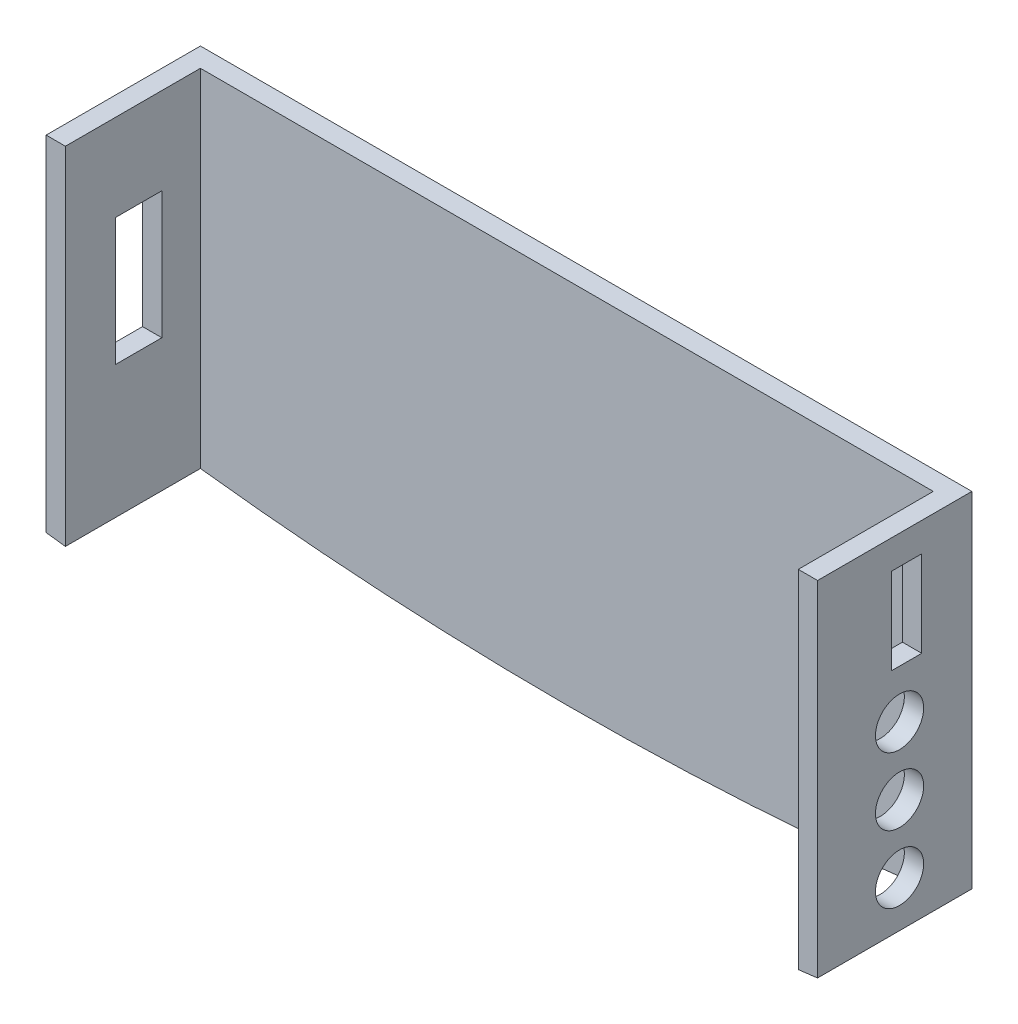
ISO-10303-21;
HEADER;
FILE_DESCRIPTION(('STEP AP214'),'2;1');
FILE_NAME('part.step','',(''),(''),'','','');
FILE_SCHEMA(('AUTOMOTIVE_DESIGN { 1 0 10303 214 1 1 1 1 }'));
ENDSEC;
DATA;
#1=APPLICATION_CONTEXT('core data for automotive mechanical design processes');
#2=APPLICATION_PROTOCOL_DEFINITION('international standard','automotive_design',2000,#1);
#3=PRODUCT_CONTEXT('',#1,'mechanical');
#4=PRODUCT('Part','Part','',(#3));
#5=PRODUCT_RELATED_PRODUCT_CATEGORY('part','',(#4));
#6=PRODUCT_DEFINITION_FORMATION('','',#4);
#7=PRODUCT_DEFINITION_CONTEXT('part definition',#1,'design');
#8=PRODUCT_DEFINITION('design','',#6,#7);
#9=PRODUCT_DEFINITION_SHAPE('','',#8);
#10=(LENGTH_UNIT() NAMED_UNIT(*) SI_UNIT(.MILLI.,.METRE.));
#11=(NAMED_UNIT(*) PLANE_ANGLE_UNIT() SI_UNIT($,.RADIAN.));
#12=(NAMED_UNIT(*) SI_UNIT($,.STERADIAN.) SOLID_ANGLE_UNIT());
#13=UNCERTAINTY_MEASURE_WITH_UNIT(LENGTH_MEASURE(1.E-05),#10,'distance_accuracy_value','');
#14=(GEOMETRIC_REPRESENTATION_CONTEXT(3) GLOBAL_UNCERTAINTY_ASSIGNED_CONTEXT((#13)) GLOBAL_UNIT_ASSIGNED_CONTEXT((#10,
#11,#12)) REPRESENTATION_CONTEXT('',''));
#15=CARTESIAN_POINT('',(0.,0.,0.));
#16=DIRECTION('',(0.,0.,1.));
#17=DIRECTION('',(1.,0.,0.));
#18=AXIS2_PLACEMENT_3D('',#15,#16,#17);
#19=CARTESIAN_POINT('',(0.,0.,16.));
#20=DIRECTION('',(0.,0.,1.));
#21=DIRECTION('',(1.,0.,0.));
#22=AXIS2_PLACEMENT_3D('',#19,#20,#21);
#23=PLANE('',#22);
#24=CARTESIAN_POINT('',(-50.4205664671254,289.886586920608,16.));
#25=DIRECTION('',(0.,0.,1.));
#26=DIRECTION('',(1.,0.,0.));
#27=AXIS2_PLACEMENT_3D('',#24,#25,#26);
#28=CIRCLE('',#27,321.75);
#29=CARTESIAN_POINT('',(-90.4205664671254,-29.3673284821631,16.));
#30=VERTEX_POINT('',#29);
#31=CARTESIAN_POINT('',(-88.4205664671254,-29.6115547015299,16.));
#32=VERTEX_POINT('',#31);
#33=EDGE_CURVE('E313',#30,#32,#28,.T.);
#34=ORIENTED_EDGE('',*,*,#33,.T.);
#35=DIRECTION('',(0.,1.,0.));
#36=VECTOR('',#35,1.);
#37=CARTESIAN_POINT('',(-88.4205664671254,0.,16.));
#38=LINE('',#37,#36);
#39=CARTESIAN_POINT('',(-88.4205664671254,6.33267151783695,16.));
#40=VERTEX_POINT('',#39);
#41=EDGE_CURVE('E295',#32,#40,#38,.T.);
#42=ORIENTED_EDGE('',*,*,#41,.T.);
#43=DIRECTION('',(-1.,0.,0.));
#44=VECTOR('',#43,1.);
#45=CARTESIAN_POINT('',(0.,6.33267151783695,16.));
#46=LINE('',#45,#44);
#47=CARTESIAN_POINT('',(-90.4205664671254,6.33267151783695,16.));
#48=VERTEX_POINT('',#47);
#49=EDGE_CURVE('E320',#40,#48,#46,.T.);
#50=ORIENTED_EDGE('',*,*,#49,.T.);
#51=DIRECTION('',(0.,1.,0.));
#52=VECTOR('',#51,1.);
#53=CARTESIAN_POINT('',(-90.4205664671254,0.,16.));
#54=LINE('',#53,#52);
#55=EDGE_CURVE('E307',#30,#48,#54,.T.);
#56=ORIENTED_EDGE('',*,*,#55,.F.);
#57=EDGE_LOOP('',(#34,#42,#50,#56));
#58=FACE_BOUND('',#57,.T.);
#59=ADVANCED_FACE('F45',(#58),#23,.T.);
#60=CARTESIAN_POINT('',(-90.4205664671254,0.,16.));
#61=DIRECTION('',(-1.,0.,0.));
#62=DIRECTION('',(0.,0.,1.));
#63=AXIS2_PLACEMENT_3D('',#60,#61,#62);
#64=PLANE('',#63);
#65=DIRECTION('',(0.,-1.,0.));
#66=VECTOR('',#65,1.);
#67=CARTESIAN_POINT('',(-90.4205664671254,-2.66732848216305,6.));
#68=LINE('',#67,#66);
#69=CARTESIAN_POINT('',(-90.4205664671254,-2.66732848216305,6.));
#70=VERTEX_POINT('',#69);
#71=CARTESIAN_POINT('',(-90.4205664671254,-15.8673284821631,6.));
#72=VERTEX_POINT('',#71);
#73=EDGE_CURVE('E239',#70,#72,#68,.T.);
#74=ORIENTED_EDGE('',*,*,#73,.F.);
#75=DIRECTION('',(0.,0.,-1.));
#76=VECTOR('',#75,1.);
#77=CARTESIAN_POINT('',(-90.4205664671254,-2.66732848216305,6.));
#78=LINE('',#77,#76);
#79=CARTESIAN_POINT('',(-90.4205664671254,-2.66732848216305,10.8));
#80=VERTEX_POINT('',#79);
#81=EDGE_CURVE('E250',#80,#70,#78,.T.);
#82=ORIENTED_EDGE('',*,*,#81,.F.);
#83=DIRECTION('',(0.,1.,0.));
#84=VECTOR('',#83,1.);
#85=CARTESIAN_POINT('',(-90.4205664671254,-2.66732848216305,10.8));
#86=LINE('',#85,#84);
#87=CARTESIAN_POINT('',(-90.4205664671254,-15.8673284821631,10.8));
#88=VERTEX_POINT('',#87);
#89=EDGE_CURVE('E246',#88,#80,#86,.T.);
#90=ORIENTED_EDGE('',*,*,#89,.F.);
#91=DIRECTION('',(0.,0.,1.));
#92=VECTOR('',#91,1.);
#93=CARTESIAN_POINT('',(-90.4205664671254,-15.8673284821631,6.));
#94=LINE('',#93,#92);
#95=EDGE_CURVE('E242',#72,#88,#94,.T.);
#96=ORIENTED_EDGE('',*,*,#95,.F.);
#97=EDGE_LOOP('',(#74,#82,#90,#96));
#98=FACE_BOUND('',#97,.T.);
#99=DIRECTION('',(0.,1.,0.));
#100=VECTOR('',#99,1.);
#101=CARTESIAN_POINT('',(-90.4205664671254,0.,0.));
#102=LINE('',#101,#100);
#103=CARTESIAN_POINT('',(-90.4205664671254,-29.3673284821631,0.));
#104=VERTEX_POINT('',#103);
#105=CARTESIAN_POINT('',(-90.4205664671254,6.33267151783695,0.));
#106=VERTEX_POINT('',#105);
#107=EDGE_CURVE('E283',#104,#106,#102,.T.);
#108=ORIENTED_EDGE('',*,*,#107,.F.);
#109=DIRECTION('',(0.,0.,-1.));
#110=VECTOR('',#109,1.);
#111=CARTESIAN_POINT('',(-90.4205664671254,-29.3673284821631,16.));
#112=LINE('',#111,#110);
#113=EDGE_CURVE('E11',#30,#104,#112,.T.);
#114=ORIENTED_EDGE('',*,*,#113,.F.);
#115=ORIENTED_EDGE('',*,*,#55,.T.);
#116=DIRECTION('',(0.,0.,-1.));
#117=VECTOR('',#116,1.);
#118=CARTESIAN_POINT('',(-90.4205664671254,6.33267151783695,16.));
#119=LINE('',#118,#117);
#120=EDGE_CURVE('E325',#48,#106,#119,.T.);
#121=ORIENTED_EDGE('',*,*,#120,.T.);
#122=EDGE_LOOP('',(#108,#114,#115,#121));
#123=FACE_BOUND('',#122,.T.);
#124=ADVANCED_FACE('F47',(#98,#123),#64,.T.);
#125=CARTESIAN_POINT('',(-50.4205664671254,289.886586920608,16.));
#126=DIRECTION('',(0.,0.,-1.));
#127=DIRECTION('',(-1.,0.,0.));
#128=AXIS2_PLACEMENT_3D('',#125,#126,#127);
#129=CYLINDRICAL_SURFACE('',#128,321.75);
#130=CARTESIAN_POINT('',(-12.4205664671254,-29.6115547015299,16.));
#131=VERTEX_POINT('',#130);
#132=CARTESIAN_POINT('',(-10.4205664671254,-29.3673284821631,16.));
#133=VERTEX_POINT('',#132);
#134=EDGE_CURVE('E311',#131,#133,#28,.T.);
#135=ORIENTED_EDGE('',*,*,#134,.F.);
#136=DIRECTION('',(0.,0.,-1.));
#137=VECTOR('',#136,1.);
#138=CARTESIAN_POINT('',(-12.4205664671254,-29.6115547015299,16.));
#139=LINE('',#138,#137);
#140=CARTESIAN_POINT('',(-12.4205664671254,-29.61155470153,2.));
#141=VERTEX_POINT('',#140);
#142=EDGE_CURVE('E284',#131,#141,#139,.T.);
#143=ORIENTED_EDGE('',*,*,#142,.T.);
#144=CARTESIAN_POINT('',(-50.4205664671254,289.886586920608,2.));
#145=DIRECTION('',(0.,0.,1.));
#146=DIRECTION('',(1.,0.,0.));
#147=AXIS2_PLACEMENT_3D('',#144,#145,#146);
#148=CIRCLE('',#147,321.75);
#149=CARTESIAN_POINT('',(-88.4205664671254,-29.61155470153,2.));
#150=VERTEX_POINT('',#149);
#151=EDGE_CURVE('E275',#150,#141,#148,.T.);
#152=ORIENTED_EDGE('',*,*,#151,.F.);
#153=DIRECTION('',(0.,0.,-1.));
#154=VECTOR('',#153,1.);
#155=CARTESIAN_POINT('',(-88.4205664671254,-29.6115547015299,16.));
#156=LINE('',#155,#154);
#157=EDGE_CURVE('E280',#32,#150,#156,.T.);
#158=ORIENTED_EDGE('',*,*,#157,.F.);
#159=ORIENTED_EDGE('',*,*,#33,.F.);
#160=ORIENTED_EDGE('',*,*,#113,.T.);
#161=CARTESIAN_POINT('',(-50.4205664671254,289.886586920608,0.));
#162=DIRECTION('',(0.,0.,1.));
#163=DIRECTION('',(1.,0.,0.));
#164=AXIS2_PLACEMENT_3D('',#161,#162,#163);
#165=CIRCLE('',#164,321.75);
#166=CARTESIAN_POINT('',(-10.4205664671254,-29.3673284821631,0.));
#167=VERTEX_POINT('',#166);
#168=EDGE_CURVE('E329',#104,#167,#165,.T.);
#169=ORIENTED_EDGE('',*,*,#168,.T.);
#170=DIRECTION('',(0.,0.,-1.));
#171=VECTOR('',#170,1.);
#172=CARTESIAN_POINT('',(-10.4205664671254,-29.3673284821631,16.));
#173=LINE('',#172,#171);
#174=EDGE_CURVE('E54',#133,#167,#173,.T.);
#175=ORIENTED_EDGE('',*,*,#174,.F.);
#176=EDGE_LOOP('',(#135,#143,#152,#158,#159,#160,#169,#175));
#177=FACE_BOUND('',#176,.T.);
#178=ADVANCED_FACE('F380',(#177),#129,.T.);
#179=CARTESIAN_POINT('',(-10.4205664671254,0.,16.));
#180=DIRECTION('',(-1.,0.,0.));
#181=DIRECTION('',(0.,0.,1.));
#182=AXIS2_PLACEMENT_3D('',#179,#180,#181);
#183=PLANE('',#182);
#184=DIRECTION('',(0.,0.,-1.));
#185=VECTOR('',#184,1.);
#186=CARTESIAN_POINT('',(-10.4205664671254,-5.60732848216305,8.36));
#187=LINE('',#186,#185);
#188=CARTESIAN_POINT('',(-10.4205664671254,-5.60732848216305,8.36));
#189=VERTEX_POINT('',#188);
#190=CARTESIAN_POINT('',(-10.4205664671254,-5.60732848216305,5.2));
#191=VERTEX_POINT('',#190);
#192=EDGE_CURVE('E61',#189,#191,#187,.T.);
#193=ORIENTED_EDGE('',*,*,#192,.F.);
#194=DIRECTION('',(0.,-1.,0.));
#195=VECTOR('',#194,1.);
#196=CARTESIAN_POINT('',(-10.4205664671254,3.33267151783695,8.36));
#197=LINE('',#196,#195);
#198=CARTESIAN_POINT('',(-10.4205664671254,3.33267151783695,8.36));
#199=VERTEX_POINT('',#198);
#200=EDGE_CURVE('E193',#199,#189,#197,.T.);
#201=ORIENTED_EDGE('',*,*,#200,.F.);
#202=DIRECTION('',(0.,0.,1.));
#203=VECTOR('',#202,1.);
#204=CARTESIAN_POINT('',(-10.4205664671254,3.33267151783695,8.36));
#205=LINE('',#204,#203);
#206=CARTESIAN_POINT('',(-10.4205664671254,3.33267151783695,5.2));
#207=VERTEX_POINT('',#206);
#208=EDGE_CURVE('E183',#207,#199,#205,.T.);
#209=ORIENTED_EDGE('',*,*,#208,.F.);
#210=DIRECTION('',(0.,1.,0.));
#211=VECTOR('',#210,1.);
#212=CARTESIAN_POINT('',(-10.4205664671254,3.33267151783695,5.2));
#213=LINE('',#212,#211);
#214=EDGE_CURVE('E188',#191,#207,#213,.T.);
#215=ORIENTED_EDGE('',*,*,#214,.F.);
#216=EDGE_LOOP('',(#193,#201,#209,#215));
#217=FACE_BOUND('',#216,.T.);
#218=CARTESIAN_POINT('',(-10.4205664671254,-10.6073284821631,7.5));
#219=DIRECTION('',(1.,0.,0.));
#220=DIRECTION('',(0.,0.,-1.));
#221=AXIS2_PLACEMENT_3D('',#218,#219,#220);
#222=CIRCLE('',#221,2.5);
#223=CARTESIAN_POINT('',(-10.4205664671254,-10.6073284821631,5.));
#224=VERTEX_POINT('',#223);
#225=EDGE_CURVE('E206',#224,#224,#222,.T.);
#226=ORIENTED_EDGE('',*,*,#225,.F.);
#227=EDGE_LOOP('',(#226));
#228=FACE_BOUND('',#227,.T.);
#229=CARTESIAN_POINT('',(-10.4205664671254,-17.6073284821631,7.5));
#230=DIRECTION('',(1.,0.,0.));
#231=DIRECTION('',(0.,0.,-1.));
#232=AXIS2_PLACEMENT_3D('',#229,#230,#231);
#233=CIRCLE('',#232,2.5);
#234=CARTESIAN_POINT('',(-10.4205664671254,-17.6073284821631,5.));
#235=VERTEX_POINT('',#234);
#236=EDGE_CURVE('E214',#235,#235,#233,.T.);
#237=ORIENTED_EDGE('',*,*,#236,.F.);
#238=EDGE_LOOP('',(#237));
#239=FACE_BOUND('',#238,.T.);
#240=CARTESIAN_POINT('',(-10.4205664671254,-24.6073284821631,7.5));
#241=DIRECTION('',(1.,0.,0.));
#242=DIRECTION('',(0.,0.,-1.));
#243=AXIS2_PLACEMENT_3D('',#240,#241,#242);
#244=CIRCLE('',#243,2.5);
#245=CARTESIAN_POINT('',(-10.4205664671254,-24.6073284821631,5.));
#246=VERTEX_POINT('',#245);
#247=EDGE_CURVE('E218',#246,#246,#244,.T.);
#248=ORIENTED_EDGE('',*,*,#247,.F.);
#249=EDGE_LOOP('',(#248));
#250=FACE_BOUND('',#249,.T.);
#251=DIRECTION('',(0.,1.,0.));
#252=VECTOR('',#251,1.);
#253=CARTESIAN_POINT('',(-10.4205664671254,0.,0.));
#254=LINE('',#253,#252);
#255=CARTESIAN_POINT('',(-10.4205664671254,6.33267151783695,0.));
#256=VERTEX_POINT('',#255);
#257=EDGE_CURVE('E332',#167,#256,#254,.T.);
#258=ORIENTED_EDGE('',*,*,#257,.T.);
#259=DIRECTION('',(0.,0.,-1.));
#260=VECTOR('',#259,1.);
#261=CARTESIAN_POINT('',(-10.4205664671254,6.33267151783695,16.));
#262=LINE('',#261,#260);
#263=CARTESIAN_POINT('',(-10.4205664671254,6.33267151783695,16.));
#264=VERTEX_POINT('',#263);
#265=EDGE_CURVE('E340',#264,#256,#262,.T.);
#266=ORIENTED_EDGE('',*,*,#265,.F.);
#267=DIRECTION('',(0.,1.,0.));
#268=VECTOR('',#267,1.);
#269=CARTESIAN_POINT('',(-10.4205664671254,0.,16.));
#270=LINE('',#269,#268);
#271=EDGE_CURVE('E317',#133,#264,#270,.T.);
#272=ORIENTED_EDGE('',*,*,#271,.F.);
#273=ORIENTED_EDGE('',*,*,#174,.T.);
#274=EDGE_LOOP('',(#258,#266,#272,#273));
#275=FACE_BOUND('',#274,.T.);
#276=ADVANCED_FACE('F349',(#217,#228,#239,#250,#275),#183,.F.);
#277=CARTESIAN_POINT('',(0.,6.33267151783695,16.));
#278=DIRECTION('',(0.,-1.,0.));
#279=DIRECTION('',(0.,0.,-1.));
#280=AXIS2_PLACEMENT_3D('',#277,#278,#279);
#281=PLANE('',#280);
#282=ORIENTED_EDGE('',*,*,#49,.F.);
#283=DIRECTION('',(0.,0.,-1.));
#284=VECTOR('',#283,1.);
#285=CARTESIAN_POINT('',(-88.4205664671254,6.33267151783695,16.));
#286=LINE('',#285,#284);
#287=CARTESIAN_POINT('',(-88.4205664671254,6.33267151783695,2.));
#288=VERTEX_POINT('',#287);
#289=EDGE_CURVE('E294',#40,#288,#286,.T.);
#290=ORIENTED_EDGE('',*,*,#289,.T.);
#291=DIRECTION('',(-1.,0.,0.));
#292=VECTOR('',#291,1.);
#293=CARTESIAN_POINT('',(0.,6.33267151783695,2.));
#294=LINE('',#293,#292);
#295=CARTESIAN_POINT('',(-12.4205664671254,6.33267151783695,2.));
#296=VERTEX_POINT('',#295);
#297=EDGE_CURVE('E279',#296,#288,#294,.T.);
#298=ORIENTED_EDGE('',*,*,#297,.F.);
#299=DIRECTION('',(0.,0.,-1.));
#300=VECTOR('',#299,1.);
#301=CARTESIAN_POINT('',(-12.4205664671254,6.33267151783695,16.));
#302=LINE('',#301,#300);
#303=CARTESIAN_POINT('',(-12.4205664671254,6.33267151783695,16.));
#304=VERTEX_POINT('',#303);
#305=EDGE_CURVE('E290',#304,#296,#302,.T.);
#306=ORIENTED_EDGE('',*,*,#305,.F.);
#307=EDGE_CURVE('E321',#264,#304,#46,.T.);
#308=ORIENTED_EDGE('',*,*,#307,.F.);
#309=ORIENTED_EDGE('',*,*,#265,.T.);
#310=DIRECTION('',(-1.,0.,0.));
#311=VECTOR('',#310,1.);
#312=CARTESIAN_POINT('',(0.,6.33267151783695,0.));
#313=LINE('',#312,#311);
#314=EDGE_CURVE('E312',#256,#106,#313,.T.);
#315=ORIENTED_EDGE('',*,*,#314,.T.);
#316=ORIENTED_EDGE('',*,*,#120,.F.);
#317=EDGE_LOOP('',(#282,#290,#298,#306,#308,#309,#315,#316));
#318=FACE_BOUND('',#317,.T.);
#319=ADVANCED_FACE('F361',(#318),#281,.F.);
#320=DIRECTION('',(0.,1.,0.));
#321=VECTOR('',#320,1.);
#322=CARTESIAN_POINT('',(-12.4205664671254,0.,16.));
#323=LINE('',#322,#321);
#324=EDGE_CURVE('E291',#131,#304,#323,.T.);
#325=ORIENTED_EDGE('',*,*,#324,.F.);
#326=ORIENTED_EDGE('',*,*,#134,.T.);
#327=ORIENTED_EDGE('',*,*,#271,.T.);
#328=ORIENTED_EDGE('',*,*,#307,.T.);
#329=EDGE_LOOP('',(#325,#326,#327,#328));
#330=FACE_BOUND('',#329,.T.);
#331=ADVANCED_FACE('F367',(#330),#23,.T.);
#332=CARTESIAN_POINT('',(0.,0.,0.));
#333=DIRECTION('',(0.,0.,1.));
#334=DIRECTION('',(1.,0.,0.));
#335=AXIS2_PLACEMENT_3D('',#332,#333,#334);
#336=PLANE('',#335);
#337=ORIENTED_EDGE('',*,*,#107,.T.);
#338=ORIENTED_EDGE('',*,*,#314,.F.);
#339=ORIENTED_EDGE('',*,*,#257,.F.);
#340=ORIENTED_EDGE('',*,*,#168,.F.);
#341=EDGE_LOOP('',(#337,#338,#339,#340));
#342=FACE_BOUND('',#341,.T.);
#343=ADVANCED_FACE('F356',(#342),#336,.F.);
#344=CARTESIAN_POINT('',(-88.4205664671254,0.,16.));
#345=DIRECTION('',(-1.,0.,0.));
#346=DIRECTION('',(0.,0.,1.));
#347=AXIS2_PLACEMENT_3D('',#344,#345,#346);
#348=PLANE('',#347);
#349=DIRECTION('',(0.,0.,1.));
#350=VECTOR('',#349,1.);
#351=CARTESIAN_POINT('',(-88.4205664671254,-2.66732848216305,6.));
#352=LINE('',#351,#350);
#353=CARTESIAN_POINT('',(-88.4205664671254,-2.66732848216305,6.));
#354=VERTEX_POINT('',#353);
#355=CARTESIAN_POINT('',(-88.4205664671254,-2.66732848216305,10.8));
#356=VERTEX_POINT('',#355);
#357=EDGE_CURVE('E231',#354,#356,#352,.T.);
#358=ORIENTED_EDGE('',*,*,#357,.F.);
#359=DIRECTION('',(0.,1.,0.));
#360=VECTOR('',#359,1.);
#361=CARTESIAN_POINT('',(-88.4205664671254,-2.66732848216305,6.));
#362=LINE('',#361,#360);
#363=CARTESIAN_POINT('',(-88.4205664671254,-15.8673284821631,6.));
#364=VERTEX_POINT('',#363);
#365=EDGE_CURVE('E235',#364,#354,#362,.T.);
#366=ORIENTED_EDGE('',*,*,#365,.F.);
#367=DIRECTION('',(0.,0.,-1.));
#368=VECTOR('',#367,1.);
#369=CARTESIAN_POINT('',(-88.4205664671254,-15.8673284821631,6.));
#370=LINE('',#369,#368);
#371=CARTESIAN_POINT('',(-88.4205664671254,-15.8673284821631,10.8));
#372=VERTEX_POINT('',#371);
#373=EDGE_CURVE('E258',#372,#364,#370,.T.);
#374=ORIENTED_EDGE('',*,*,#373,.F.);
#375=DIRECTION('',(0.,-1.,0.));
#376=VECTOR('',#375,1.);
#377=CARTESIAN_POINT('',(-88.4205664671254,-2.66732848216305,10.8));
#378=LINE('',#377,#376);
#379=EDGE_CURVE('E187',#356,#372,#378,.T.);
#380=ORIENTED_EDGE('',*,*,#379,.F.);
#381=EDGE_LOOP('',(#358,#366,#374,#380));
#382=FACE_BOUND('',#381,.T.);
#383=DIRECTION('',(0.,1.,0.));
#384=VECTOR('',#383,1.);
#385=CARTESIAN_POINT('',(-88.4205664671254,0.,2.));
#386=LINE('',#385,#384);
#387=EDGE_CURVE('E271',#150,#288,#386,.T.);
#388=ORIENTED_EDGE('',*,*,#387,.T.);
#389=ORIENTED_EDGE('',*,*,#289,.F.);
#390=ORIENTED_EDGE('',*,*,#41,.F.);
#391=ORIENTED_EDGE('',*,*,#157,.T.);
#392=EDGE_LOOP('',(#388,#389,#390,#391));
#393=FACE_BOUND('',#392,.T.);
#394=ADVANCED_FACE('F373',(#382,#393),#348,.F.);
#395=CARTESIAN_POINT('',(-12.4205664671254,0.,16.));
#396=DIRECTION('',(-1.,0.,0.));
#397=DIRECTION('',(0.,0.,1.));
#398=AXIS2_PLACEMENT_3D('',#395,#396,#397);
#399=PLANE('',#398);
#400=DIRECTION('',(0.,-1.,0.));
#401=VECTOR('',#400,1.);
#402=CARTESIAN_POINT('',(-12.4205664671254,3.33267151783695,8.36));
#403=LINE('',#402,#401);
#404=CARTESIAN_POINT('',(-12.4205664671254,3.33267151783695,8.36));
#405=VERTEX_POINT('',#404);
#406=CARTESIAN_POINT('',(-12.4205664671254,-5.60732848216305,8.36));
#407=VERTEX_POINT('',#406);
#408=EDGE_CURVE('E176',#405,#407,#403,.T.);
#409=ORIENTED_EDGE('',*,*,#408,.T.);
#410=DIRECTION('',(0.,0.,-1.));
#411=VECTOR('',#410,1.);
#412=CARTESIAN_POINT('',(-12.4205664671254,-5.60732848216305,8.36));
#413=LINE('',#412,#411);
#414=CARTESIAN_POINT('',(-12.4205664671254,-5.60732848216305,5.2));
#415=VERTEX_POINT('',#414);
#416=EDGE_CURVE('E168',#407,#415,#413,.T.);
#417=ORIENTED_EDGE('',*,*,#416,.T.);
#418=DIRECTION('',(0.,1.,0.));
#419=VECTOR('',#418,1.);
#420=CARTESIAN_POINT('',(-12.4205664671254,3.33267151783695,5.2));
#421=LINE('',#420,#419);
#422=CARTESIAN_POINT('',(-12.4205664671254,3.33267151783695,5.2));
#423=VERTEX_POINT('',#422);
#424=EDGE_CURVE('E157',#415,#423,#421,.T.);
#425=ORIENTED_EDGE('',*,*,#424,.T.);
#426=DIRECTION('',(0.,0.,1.));
#427=VECTOR('',#426,1.);
#428=CARTESIAN_POINT('',(-12.4205664671254,3.33267151783695,8.36));
#429=LINE('',#428,#427);
#430=EDGE_CURVE('E171',#423,#405,#429,.T.);
#431=ORIENTED_EDGE('',*,*,#430,.T.);
#432=EDGE_LOOP('',(#409,#417,#425,#431));
#433=FACE_BOUND('',#432,.T.);
#434=CARTESIAN_POINT('',(-12.4205664671254,-10.6073284821631,7.5));
#435=DIRECTION('',(-1.,0.,0.));
#436=DIRECTION('',(0.,0.,1.));
#437=AXIS2_PLACEMENT_3D('',#434,#435,#436);
#438=CIRCLE('',#437,2.5);
#439=CARTESIAN_POINT('',(-12.4205664671254,-10.6073284821631,10.));
#440=VERTEX_POINT('',#439);
#441=EDGE_CURVE('E199',#440,#440,#438,.F.);
#442=ORIENTED_EDGE('',*,*,#441,.T.);
#443=EDGE_LOOP('',(#442));
#444=FACE_BOUND('',#443,.T.);
#445=CARTESIAN_POINT('',(-12.4205664671254,-17.6073284821631,7.5));
#446=DIRECTION('',(-1.,0.,0.));
#447=DIRECTION('',(0.,0.,1.));
#448=AXIS2_PLACEMENT_3D('',#445,#446,#447);
#449=CIRCLE('',#448,2.5);
#450=CARTESIAN_POINT('',(-12.4205664671254,-17.6073284821631,10.));
#451=VERTEX_POINT('',#450);
#452=EDGE_CURVE('E210',#451,#451,#449,.F.);
#453=ORIENTED_EDGE('',*,*,#452,.T.);
#454=EDGE_LOOP('',(#453));
#455=FACE_BOUND('',#454,.T.);
#456=CARTESIAN_POINT('',(-12.4205664671254,-24.6073284821631,7.5));
#457=DIRECTION('',(-1.,0.,0.));
#458=DIRECTION('',(0.,0.,1.));
#459=AXIS2_PLACEMENT_3D('',#456,#457,#458);
#460=CIRCLE('',#459,2.5);
#461=CARTESIAN_POINT('',(-12.4205664671254,-24.6073284821631,10.));
#462=VERTEX_POINT('',#461);
#463=EDGE_CURVE('E225',#462,#462,#460,.F.);
#464=ORIENTED_EDGE('',*,*,#463,.T.);
#465=EDGE_LOOP('',(#464));
#466=FACE_BOUND('',#465,.T.);
#467=DIRECTION('',(0.,1.,0.));
#468=VECTOR('',#467,1.);
#469=CARTESIAN_POINT('',(-12.4205664671254,0.,2.));
#470=LINE('',#469,#468);
#471=EDGE_CURVE('E276',#141,#296,#470,.T.);
#472=ORIENTED_EDGE('',*,*,#471,.F.);
#473=ORIENTED_EDGE('',*,*,#142,.F.);
#474=ORIENTED_EDGE('',*,*,#324,.T.);
#475=ORIENTED_EDGE('',*,*,#305,.T.);
#476=EDGE_LOOP('',(#472,#473,#474,#475));
#477=FACE_BOUND('',#476,.T.);
#478=ADVANCED_FACE('F174',(#433,#444,#455,#466,#477),#399,.T.);
#479=CARTESIAN_POINT('',(0.,0.,2.));
#480=DIRECTION('',(0.,0.,1.));
#481=DIRECTION('',(1.,0.,0.));
#482=AXIS2_PLACEMENT_3D('',#479,#480,#481);
#483=PLANE('',#482);
#484=ORIENTED_EDGE('',*,*,#387,.F.);
#485=ORIENTED_EDGE('',*,*,#151,.T.);
#486=ORIENTED_EDGE('',*,*,#471,.T.);
#487=ORIENTED_EDGE('',*,*,#297,.T.);
#488=EDGE_LOOP('',(#484,#485,#486,#487));
#489=FACE_BOUND('',#488,.T.);
#490=ADVANCED_FACE('F378',(#489),#483,.T.);
#491=CARTESIAN_POINT('',(-10.4195664671254,-2.66732848216305,6.));
#492=DIRECTION('',(0.,0.,-1.));
#493=DIRECTION('',(0.,1.,0.));
#494=AXIS2_PLACEMENT_3D('',#491,#492,#493);
#495=PLANE('',#494);
#496=ORIENTED_EDGE('',*,*,#365,.T.);
#497=DIRECTION('',(-1.,0.,0.));
#498=VECTOR('',#497,1.);
#499=CARTESIAN_POINT('',(-10.4195664671254,-2.66732848216305,6.));
#500=LINE('',#499,#498);
#501=EDGE_CURVE('E255',#354,#70,#500,.T.);
#502=ORIENTED_EDGE('',*,*,#501,.T.);
#503=ORIENTED_EDGE('',*,*,#73,.T.);
#504=DIRECTION('',(-1.,0.,0.));
#505=VECTOR('',#504,1.);
#506=CARTESIAN_POINT('',(-10.4195664671254,-15.8673284821631,6.));
#507=LINE('',#506,#505);
#508=EDGE_CURVE('E254',#364,#72,#507,.T.);
#509=ORIENTED_EDGE('',*,*,#508,.F.);
#510=EDGE_LOOP('',(#496,#502,#503,#509));
#511=FACE_BOUND('',#510,.T.);
#512=ADVANCED_FACE('F389',(#511),#495,.F.);
#513=CARTESIAN_POINT('',(-10.4195664671254,-2.66732848216305,6.));
#514=DIRECTION('',(0.,1.,0.));
#515=DIRECTION('',(0.,0.,1.));
#516=AXIS2_PLACEMENT_3D('',#513,#514,#515);
#517=PLANE('',#516);
#518=ORIENTED_EDGE('',*,*,#357,.T.);
#519=DIRECTION('',(-1.,0.,0.));
#520=VECTOR('',#519,1.);
#521=CARTESIAN_POINT('',(-10.4195664671254,-2.66732848216305,10.8));
#522=LINE('',#521,#520);
#523=EDGE_CURVE('E259',#356,#80,#522,.T.);
#524=ORIENTED_EDGE('',*,*,#523,.T.);
#525=ORIENTED_EDGE('',*,*,#81,.T.);
#526=ORIENTED_EDGE('',*,*,#501,.F.);
#527=EDGE_LOOP('',(#518,#524,#525,#526));
#528=FACE_BOUND('',#527,.T.);
#529=ADVANCED_FACE('F531',(#528),#517,.F.);
#530=CARTESIAN_POINT('',(-10.4195664671254,-2.66732848216305,10.8));
#531=DIRECTION('',(0.,0.,1.));
#532=DIRECTION('',(1.,0.,0.));
#533=AXIS2_PLACEMENT_3D('',#530,#531,#532);
#534=PLANE('',#533);
#535=ORIENTED_EDGE('',*,*,#379,.T.);
#536=DIRECTION('',(-1.,0.,0.));
#537=VECTOR('',#536,1.);
#538=CARTESIAN_POINT('',(-10.4195664671254,-15.8673284821631,10.8));
#539=LINE('',#538,#537);
#540=EDGE_CURVE('E262',#372,#88,#539,.T.);
#541=ORIENTED_EDGE('',*,*,#540,.T.);
#542=ORIENTED_EDGE('',*,*,#89,.T.);
#543=ORIENTED_EDGE('',*,*,#523,.F.);
#544=EDGE_LOOP('',(#535,#541,#542,#543));
#545=FACE_BOUND('',#544,.T.);
#546=ADVANCED_FACE('F522',(#545),#534,.F.);
#547=CARTESIAN_POINT('',(-10.4195664671254,-15.8673284821631,6.));
#548=DIRECTION('',(0.,-1.,0.));
#549=DIRECTION('',(0.,0.,-1.));
#550=AXIS2_PLACEMENT_3D('',#547,#548,#549);
#551=PLANE('',#550);
#552=ORIENTED_EDGE('',*,*,#373,.T.);
#553=ORIENTED_EDGE('',*,*,#508,.T.);
#554=ORIENTED_EDGE('',*,*,#95,.T.);
#555=ORIENTED_EDGE('',*,*,#540,.F.);
#556=EDGE_LOOP('',(#552,#553,#554,#555));
#557=FACE_BOUND('',#556,.T.);
#558=ADVANCED_FACE('F427',(#557),#551,.F.);
#559=CARTESIAN_POINT('',(-90.4215664671254,-24.6073284821631,7.5));
#560=DIRECTION('',(1.,0.,0.));
#561=DIRECTION('',(0.,0.,-1.));
#562=AXIS2_PLACEMENT_3D('',#559,#560,#561);
#563=CYLINDRICAL_SURFACE('',#562,2.5);
#564=ORIENTED_EDGE('',*,*,#463,.F.);
#565=EDGE_LOOP('',(#564));
#566=FACE_BOUND('',#565,.T.);
#567=ORIENTED_EDGE('',*,*,#247,.T.);
#568=EDGE_LOOP('',(#567));
#569=FACE_BOUND('',#568,.T.);
#570=ADVANCED_FACE('F440',(#566,#569),#563,.F.);
#571=CARTESIAN_POINT('',(-90.4215664671254,-17.6073284821631,7.5));
#572=DIRECTION('',(1.,0.,0.));
#573=DIRECTION('',(0.,0.,-1.));
#574=AXIS2_PLACEMENT_3D('',#571,#572,#573);
#575=CYLINDRICAL_SURFACE('',#574,2.5);
#576=ORIENTED_EDGE('',*,*,#452,.F.);
#577=EDGE_LOOP('',(#576));
#578=FACE_BOUND('',#577,.T.);
#579=ORIENTED_EDGE('',*,*,#236,.T.);
#580=EDGE_LOOP('',(#579));
#581=FACE_BOUND('',#580,.T.);
#582=ADVANCED_FACE('F445',(#578,#581),#575,.F.);
#583=CARTESIAN_POINT('',(-90.4215664671254,-10.6073284821631,7.5));
#584=DIRECTION('',(1.,0.,0.));
#585=DIRECTION('',(0.,0.,-1.));
#586=AXIS2_PLACEMENT_3D('',#583,#584,#585);
#587=CYLINDRICAL_SURFACE('',#586,2.5);
#588=ORIENTED_EDGE('',*,*,#441,.F.);
#589=EDGE_LOOP('',(#588));
#590=FACE_BOUND('',#589,.T.);
#591=ORIENTED_EDGE('',*,*,#225,.T.);
#592=EDGE_LOOP('',(#591));
#593=FACE_BOUND('',#592,.T.);
#594=ADVANCED_FACE('F456',(#590,#593),#587,.F.);
#595=CARTESIAN_POINT('',(-90.4215664671254,3.33267151783695,8.36));
#596=DIRECTION('',(0.,0.,1.));
#597=DIRECTION('',(0.,-1.,0.));
#598=AXIS2_PLACEMENT_3D('',#595,#596,#597);
#599=PLANE('',#598);
#600=DIRECTION('',(1.,0.,0.));
#601=VECTOR('',#600,1.);
#602=CARTESIAN_POINT('',(-90.4215664671254,3.33267151783695,8.36));
#603=LINE('',#602,#601);
#604=EDGE_CURVE('E165',#405,#199,#603,.T.);
#605=ORIENTED_EDGE('',*,*,#604,.T.);
#606=ORIENTED_EDGE('',*,*,#200,.T.);
#607=DIRECTION('',(1.,0.,0.));
#608=VECTOR('',#607,1.);
#609=CARTESIAN_POINT('',(-90.4215664671254,-5.60732848216305,8.36));
#610=LINE('',#609,#608);
#611=EDGE_CURVE('E178',#407,#189,#610,.T.);
#612=ORIENTED_EDGE('',*,*,#611,.F.);
#613=ORIENTED_EDGE('',*,*,#408,.F.);
#614=EDGE_LOOP('',(#605,#606,#612,#613));
#615=FACE_BOUND('',#614,.T.);
#616=ADVANCED_FACE('F467',(#615),#599,.F.);
#617=CARTESIAN_POINT('',(-90.4215664671254,-5.60732848216305,8.36));
#618=DIRECTION('',(0.,-1.,0.));
#619=DIRECTION('',(0.,0.,-1.));
#620=AXIS2_PLACEMENT_3D('',#617,#618,#619);
#621=PLANE('',#620);
#622=ORIENTED_EDGE('',*,*,#611,.T.);
#623=ORIENTED_EDGE('',*,*,#192,.T.);
#624=DIRECTION('',(1.,0.,0.));
#625=VECTOR('',#624,1.);
#626=CARTESIAN_POINT('',(-90.4215664671254,-5.60732848216305,5.2));
#627=LINE('',#626,#625);
#628=EDGE_CURVE('E159',#415,#191,#627,.T.);
#629=ORIENTED_EDGE('',*,*,#628,.F.);
#630=ORIENTED_EDGE('',*,*,#416,.F.);
#631=EDGE_LOOP('',(#622,#623,#629,#630));
#632=FACE_BOUND('',#631,.T.);
#633=ADVANCED_FACE('F167',(#632),#621,.F.);
#634=CARTESIAN_POINT('',(-90.4215664671254,3.33267151783695,8.36));
#635=DIRECTION('',(0.,1.,0.));
#636=DIRECTION('',(0.,0.,1.));
#637=AXIS2_PLACEMENT_3D('',#634,#635,#636);
#638=PLANE('',#637);
#639=DIRECTION('',(1.,0.,0.));
#640=VECTOR('',#639,1.);
#641=CARTESIAN_POINT('',(-90.4215664671254,3.33267151783695,5.2));
#642=LINE('',#641,#640);
#643=EDGE_CURVE('E69',#423,#207,#642,.T.);
#644=ORIENTED_EDGE('',*,*,#643,.T.);
#645=ORIENTED_EDGE('',*,*,#208,.T.);
#646=ORIENTED_EDGE('',*,*,#604,.F.);
#647=ORIENTED_EDGE('',*,*,#430,.F.);
#648=EDGE_LOOP('',(#644,#645,#646,#647));
#649=FACE_BOUND('',#648,.T.);
#650=ADVANCED_FACE('F488',(#649),#638,.F.);
#651=CARTESIAN_POINT('',(-90.4215664671254,3.33267151783695,5.2));
#652=DIRECTION('',(0.,0.,-1.));
#653=DIRECTION('',(0.,1.,0.));
#654=AXIS2_PLACEMENT_3D('',#651,#652,#653);
#655=PLANE('',#654);
#656=ORIENTED_EDGE('',*,*,#628,.T.);
#657=ORIENTED_EDGE('',*,*,#214,.T.);
#658=ORIENTED_EDGE('',*,*,#643,.F.);
#659=ORIENTED_EDGE('',*,*,#424,.F.);
#660=EDGE_LOOP('',(#656,#657,#658,#659));
#661=FACE_BOUND('',#660,.T.);
#662=ADVANCED_FACE('F158',(#661),#655,.F.);
#663=CLOSED_SHELL('',(#59,#124,#178,#276,#319,#331,#343,#394,#478,#490,#512,#529,#546,#558,#570,
#582,#594,#616,#633,#650,#662));
#664=MANIFOLD_SOLID_BREP('B2',#663);
#665=ADVANCED_BREP_SHAPE_REPRESENTATION('',(#18,#664),#14);
#666=SHAPE_DEFINITION_REPRESENTATION(#9,#665);
ENDSEC;
END-ISO-10303-21;
